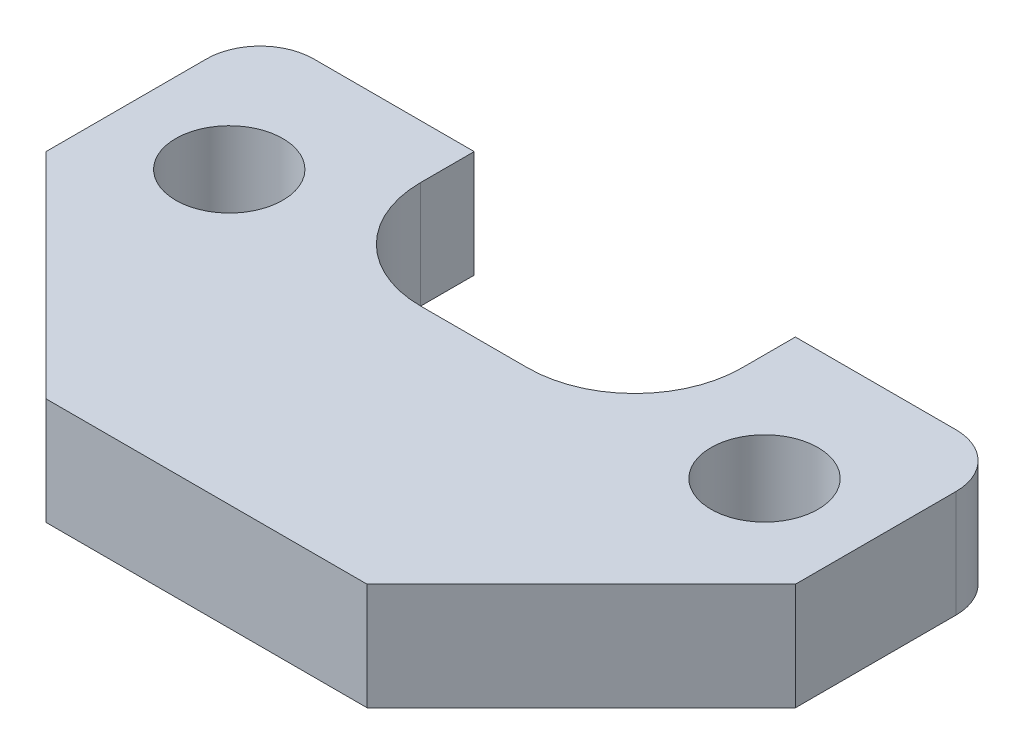
ISO-10303-21;
HEADER;
FILE_DESCRIPTION(('STEP AP214'),'2;1');
FILE_NAME('part.step','',(''),(''),'','','');
FILE_SCHEMA(('AUTOMOTIVE_DESIGN { 1 0 10303 214 1 1 1 1 }'));
ENDSEC;
DATA;
#1=APPLICATION_CONTEXT('core data for automotive mechanical design processes');
#2=APPLICATION_PROTOCOL_DEFINITION('international standard','automotive_design',2000,#1);
#3=PRODUCT_CONTEXT('',#1,'mechanical');
#4=PRODUCT('Part','Part','',(#3));
#5=PRODUCT_RELATED_PRODUCT_CATEGORY('part','',(#4));
#6=PRODUCT_DEFINITION_FORMATION('','',#4);
#7=PRODUCT_DEFINITION_CONTEXT('part definition',#1,'design');
#8=PRODUCT_DEFINITION('design','',#6,#7);
#9=PRODUCT_DEFINITION_SHAPE('','',#8);
#10=(LENGTH_UNIT() NAMED_UNIT(*) SI_UNIT(.MILLI.,.METRE.));
#11=(NAMED_UNIT(*) PLANE_ANGLE_UNIT() SI_UNIT($,.RADIAN.));
#12=(NAMED_UNIT(*) SI_UNIT($,.STERADIAN.) SOLID_ANGLE_UNIT());
#13=UNCERTAINTY_MEASURE_WITH_UNIT(LENGTH_MEASURE(1.E-05),#10,'distance_accuracy_value','');
#14=(GEOMETRIC_REPRESENTATION_CONTEXT(3) GLOBAL_UNCERTAINTY_ASSIGNED_CONTEXT((#13)) GLOBAL_UNIT_ASSIGNED_CONTEXT((#10,
#11,#12)) REPRESENTATION_CONTEXT('',''));
#15=CARTESIAN_POINT('',(0.,0.,0.));
#16=DIRECTION('',(0.,0.,1.));
#17=DIRECTION('',(1.,0.,0.));
#18=AXIS2_PLACEMENT_3D('',#15,#16,#17);
#19=CARTESIAN_POINT('',(-15.,-5.,-12.8823080147469));
#20=DIRECTION('',(1.,0.,0.));
#21=DIRECTION('',(0.,0.,-1.));
#22=AXIS2_PLACEMENT_3D('',#19,#20,#21);
#23=PLANE('',#22);
#24=DIRECTION('',(0.,1.,0.));
#25=VECTOR('',#24,1.);
#26=CARTESIAN_POINT('',(-15.,-5.,-12.8823080147469));
#27=LINE('',#26,#25);
#28=CARTESIAN_POINT('',(-15.,-5.,-12.8823080147469));
#29=VERTEX_POINT('',#28);
#30=CARTESIAN_POINT('',(-15.,5.,-12.8823080147469));
#31=VERTEX_POINT('',#30);
#32=EDGE_CURVE('E42',#29,#31,#27,.T.);
#33=ORIENTED_EDGE('',*,*,#32,.T.);
#34=DIRECTION('',(0.,0.,-1.));
#35=VECTOR('',#34,1.);
#36=CARTESIAN_POINT('',(-15.,5.,-12.8823080147469));
#37=LINE('',#36,#35);
#38=CARTESIAN_POINT('',(-15.,5.,-7.88230801474701));
#39=VERTEX_POINT('',#38);
#40=EDGE_CURVE('E139',#39,#31,#37,.T.);
#41=ORIENTED_EDGE('',*,*,#40,.F.);
#42=DIRECTION('',(0.,1.,0.));
#43=VECTOR('',#42,1.);
#44=CARTESIAN_POINT('',(-15.,-5.,-7.88230801474701));
#45=LINE('',#44,#43);
#46=CARTESIAN_POINT('',(-15.,-5.,-7.88230801474701));
#47=VERTEX_POINT('',#46);
#48=EDGE_CURVE('E11',#47,#39,#45,.T.);
#49=ORIENTED_EDGE('',*,*,#48,.F.);
#50=DIRECTION('',(0.,0.,-1.));
#51=VECTOR('',#50,1.);
#52=CARTESIAN_POINT('',(-15.,-5.,-12.8823080147469));
#53=LINE('',#52,#51);
#54=EDGE_CURVE('E140',#47,#29,#53,.T.);
#55=ORIENTED_EDGE('',*,*,#54,.T.);
#56=EDGE_LOOP('',(#33,#41,#49,#55));
#57=FACE_BOUND('',#56,.T.);
#58=ADVANCED_FACE('F39',(#57),#23,.T.);
#59=CARTESIAN_POINT('',(-4.99999999999999,-5.,-7.88230801474694));
#60=DIRECTION('',(0.,1.,0.));
#61=DIRECTION('',(0.,0.,1.));
#62=AXIS2_PLACEMENT_3D('',#59,#60,#61);
#63=CYLINDRICAL_SURFACE('',#62,10.);
#64=ORIENTED_EDGE('',*,*,#48,.T.);
#65=CARTESIAN_POINT('',(-4.99999999999999,5.,-7.88230801474694));
#66=DIRECTION('',(0.,-1.,0.));
#67=DIRECTION('',(0.,0.,1.));
#68=AXIS2_PLACEMENT_3D('',#65,#66,#67);
#69=CIRCLE('',#68,10.);
#70=CARTESIAN_POINT('',(-4.99999999999992,5.,2.11769198525306));
#71=VERTEX_POINT('',#70);
#72=EDGE_CURVE('E158',#71,#39,#69,.T.);
#73=ORIENTED_EDGE('',*,*,#72,.F.);
#74=DIRECTION('',(0.,1.,0.));
#75=VECTOR('',#74,1.);
#76=CARTESIAN_POINT('',(-4.99999999999992,-5.,2.11769198525306));
#77=LINE('',#76,#75);
#78=CARTESIAN_POINT('',(-4.99999999999992,-5.,2.11769198525306));
#79=VERTEX_POINT('',#78);
#80=EDGE_CURVE('E47',#79,#71,#77,.T.);
#81=ORIENTED_EDGE('',*,*,#80,.F.);
#82=CARTESIAN_POINT('',(-4.99999999999999,-5.,-7.88230801474694));
#83=DIRECTION('',(0.,-1.,0.));
#84=DIRECTION('',(0.,0.,1.));
#85=AXIS2_PLACEMENT_3D('',#82,#83,#84);
#86=CIRCLE('',#85,10.);
#87=EDGE_CURVE('E145',#79,#47,#86,.T.);
#88=ORIENTED_EDGE('',*,*,#87,.T.);
#89=EDGE_LOOP('',(#64,#73,#81,#88));
#90=FACE_BOUND('',#89,.T.);
#91=ADVANCED_FACE('F305',(#90),#63,.F.);
#92=CARTESIAN_POINT('',(-4.99999999999992,-5.,2.11769198525306));
#93=DIRECTION('',(0.,0.,-1.));
#94=DIRECTION('',(-1.,0.,0.));
#95=AXIS2_PLACEMENT_3D('',#92,#93,#94);
#96=PLANE('',#95);
#97=ORIENTED_EDGE('',*,*,#80,.T.);
#98=DIRECTION('',(-1.,0.,0.));
#99=VECTOR('',#98,1.);
#100=CARTESIAN_POINT('',(-4.99999999999992,5.,2.11769198525306));
#101=LINE('',#100,#99);
#102=CARTESIAN_POINT('',(4.99999999999993,5.,2.11769198525306));
#103=VERTEX_POINT('',#102);
#104=EDGE_CURVE('E194',#103,#71,#101,.T.);
#105=ORIENTED_EDGE('',*,*,#104,.F.);
#106=DIRECTION('',(0.,1.,0.));
#107=VECTOR('',#106,1.);
#108=CARTESIAN_POINT('',(4.99999999999993,-5.,2.11769198525306));
#109=LINE('',#108,#107);
#110=CARTESIAN_POINT('',(4.99999999999993,-5.,2.11769198525306));
#111=VERTEX_POINT('',#110);
#112=EDGE_CURVE('E240',#111,#103,#109,.T.);
#113=ORIENTED_EDGE('',*,*,#112,.F.);
#114=DIRECTION('',(-1.,0.,0.));
#115=VECTOR('',#114,1.);
#116=CARTESIAN_POINT('',(-4.99999999999992,-5.,2.11769198525306));
#117=LINE('',#116,#115);
#118=EDGE_CURVE('E236',#111,#79,#117,.T.);
#119=ORIENTED_EDGE('',*,*,#118,.T.);
#120=EDGE_LOOP('',(#97,#105,#113,#119));
#121=FACE_BOUND('',#120,.T.);
#122=ADVANCED_FACE('F304',(#121),#96,.T.);
#123=CARTESIAN_POINT('',(5.00000000000001,-5.,-7.88230801474694));
#124=DIRECTION('',(0.,1.,0.));
#125=DIRECTION('',(0.,0.,1.));
#126=AXIS2_PLACEMENT_3D('',#123,#124,#125);
#127=CYLINDRICAL_SURFACE('',#126,10.);
#128=ORIENTED_EDGE('',*,*,#112,.T.);
#129=CARTESIAN_POINT('',(5.00000000000001,5.,-7.88230801474694));
#130=DIRECTION('',(0.,-1.,0.));
#131=DIRECTION('',(0.,0.,-1.));
#132=AXIS2_PLACEMENT_3D('',#129,#130,#131);
#133=CIRCLE('',#132,10.);
#134=CARTESIAN_POINT('',(15.,5.,-7.88230801474701));
#135=VERTEX_POINT('',#134);
#136=EDGE_CURVE('E191',#135,#103,#133,.T.);
#137=ORIENTED_EDGE('',*,*,#136,.F.);
#138=DIRECTION('',(0.,1.,0.));
#139=VECTOR('',#138,1.);
#140=CARTESIAN_POINT('',(15.,-5.,-7.88230801474701));
#141=LINE('',#140,#139);
#142=CARTESIAN_POINT('',(15.,-5.,-7.88230801474701));
#143=VERTEX_POINT('',#142);
#144=EDGE_CURVE('E242',#143,#135,#141,.T.);
#145=ORIENTED_EDGE('',*,*,#144,.F.);
#146=CARTESIAN_POINT('',(5.00000000000001,-5.,-7.88230801474694));
#147=DIRECTION('',(0.,-1.,0.));
#148=DIRECTION('',(0.,0.,-1.));
#149=AXIS2_PLACEMENT_3D('',#146,#147,#148);
#150=CIRCLE('',#149,10.);
#151=EDGE_CURVE('E233',#143,#111,#150,.T.);
#152=ORIENTED_EDGE('',*,*,#151,.T.);
#153=EDGE_LOOP('',(#128,#137,#145,#152));
#154=FACE_BOUND('',#153,.T.);
#155=ADVANCED_FACE('F300',(#154),#127,.F.);
#156=CARTESIAN_POINT('',(15.,-5.,-12.8823080147469));
#157=DIRECTION('',(-1.,0.,0.));
#158=DIRECTION('',(0.,0.,1.));
#159=AXIS2_PLACEMENT_3D('',#156,#157,#158);
#160=PLANE('',#159);
#161=ORIENTED_EDGE('',*,*,#144,.T.);
#162=DIRECTION('',(0.,0.,1.));
#163=VECTOR('',#162,1.);
#164=CARTESIAN_POINT('',(15.,5.,-12.8823080147469));
#165=LINE('',#164,#163);
#166=CARTESIAN_POINT('',(15.,5.,-12.8823080147469));
#167=VERTEX_POINT('',#166);
#168=EDGE_CURVE('E188',#167,#135,#165,.T.);
#169=ORIENTED_EDGE('',*,*,#168,.F.);
#170=DIRECTION('',(0.,1.,0.));
#171=VECTOR('',#170,1.);
#172=CARTESIAN_POINT('',(15.,-5.,-12.8823080147469));
#173=LINE('',#172,#171);
#174=CARTESIAN_POINT('',(15.,-5.,-12.8823080147469));
#175=VERTEX_POINT('',#174);
#176=EDGE_CURVE('E244',#175,#167,#173,.T.);
#177=ORIENTED_EDGE('',*,*,#176,.F.);
#178=DIRECTION('',(0.,0.,1.));
#179=VECTOR('',#178,1.);
#180=CARTESIAN_POINT('',(15.,-5.,-12.8823080147469));
#181=LINE('',#180,#179);
#182=EDGE_CURVE('E230',#175,#143,#181,.T.);
#183=ORIENTED_EDGE('',*,*,#182,.T.);
#184=EDGE_LOOP('',(#161,#169,#177,#183));
#185=FACE_BOUND('',#184,.T.);
#186=ADVANCED_FACE('F295',(#185),#160,.T.);
#187=CARTESIAN_POINT('',(30.,-5.,-12.8823080147469));
#188=DIRECTION('',(0.,0.,-1.));
#189=DIRECTION('',(-1.,0.,0.));
#190=AXIS2_PLACEMENT_3D('',#187,#188,#189);
#191=PLANE('',#190);
#192=ORIENTED_EDGE('',*,*,#176,.T.);
#193=DIRECTION('',(-1.,0.,0.));
#194=VECTOR('',#193,1.);
#195=CARTESIAN_POINT('',(30.,5.,-12.8823080147469));
#196=LINE('',#195,#194);
#197=CARTESIAN_POINT('',(30.,5.,-12.8823080147469));
#198=VERTEX_POINT('',#197);
#199=EDGE_CURVE('E185',#198,#167,#196,.T.);
#200=ORIENTED_EDGE('',*,*,#199,.F.);
#201=DIRECTION('',(0.,1.,0.));
#202=VECTOR('',#201,1.);
#203=CARTESIAN_POINT('',(30.,-5.,-12.8823080147469));
#204=LINE('',#203,#202);
#205=CARTESIAN_POINT('',(30.,-5.,-12.8823080147469));
#206=VERTEX_POINT('',#205);
#207=EDGE_CURVE('E246',#206,#198,#204,.T.);
#208=ORIENTED_EDGE('',*,*,#207,.F.);
#209=DIRECTION('',(-1.,0.,0.));
#210=VECTOR('',#209,1.);
#211=CARTESIAN_POINT('',(30.,-5.,-12.8823080147469));
#212=LINE('',#211,#210);
#213=EDGE_CURVE('E227',#206,#175,#212,.T.);
#214=ORIENTED_EDGE('',*,*,#213,.T.);
#215=EDGE_LOOP('',(#192,#200,#208,#214));
#216=FACE_BOUND('',#215,.T.);
#217=ADVANCED_FACE('F293',(#216),#191,.T.);
#218=CARTESIAN_POINT('',(30.,-5.,-7.88230801474694));
#219=DIRECTION('',(0.,1.,0.));
#220=DIRECTION('',(0.,0.,1.));
#221=AXIS2_PLACEMENT_3D('',#218,#219,#220);
#222=CYLINDRICAL_SURFACE('',#221,5.);
#223=ORIENTED_EDGE('',*,*,#207,.T.);
#224=CARTESIAN_POINT('',(30.,5.,-7.88230801474694));
#225=DIRECTION('',(0.,1.,0.));
#226=DIRECTION('',(0.,0.,1.));
#227=AXIS2_PLACEMENT_3D('',#224,#225,#226);
#228=CIRCLE('',#227,5.);
#229=CARTESIAN_POINT('',(35.,5.,-7.8823080147469));
#230=VERTEX_POINT('',#229);
#231=EDGE_CURVE('E182',#230,#198,#228,.T.);
#232=ORIENTED_EDGE('',*,*,#231,.F.);
#233=DIRECTION('',(0.,1.,0.));
#234=VECTOR('',#233,1.);
#235=CARTESIAN_POINT('',(35.,-5.,-7.8823080147469));
#236=LINE('',#235,#234);
#237=CARTESIAN_POINT('',(35.,-5.,-7.8823080147469));
#238=VERTEX_POINT('',#237);
#239=EDGE_CURVE('E248',#238,#230,#236,.T.);
#240=ORIENTED_EDGE('',*,*,#239,.F.);
#241=CARTESIAN_POINT('',(30.,-5.,-7.88230801474694));
#242=DIRECTION('',(0.,1.,0.));
#243=DIRECTION('',(0.,0.,1.));
#244=AXIS2_PLACEMENT_3D('',#241,#242,#243);
#245=CIRCLE('',#244,5.);
#246=EDGE_CURVE('E224',#238,#206,#245,.T.);
#247=ORIENTED_EDGE('',*,*,#246,.T.);
#248=EDGE_LOOP('',(#223,#232,#240,#247));
#249=FACE_BOUND('',#248,.T.);
#250=ADVANCED_FACE('F288',(#249),#222,.T.);
#251=CARTESIAN_POINT('',(35.,-5.,7.11769198525307));
#252=DIRECTION('',(1.,0.,0.));
#253=DIRECTION('',(0.,0.,-1.));
#254=AXIS2_PLACEMENT_3D('',#251,#252,#253);
#255=PLANE('',#254);
#256=ORIENTED_EDGE('',*,*,#239,.T.);
#257=DIRECTION('',(0.,0.,-1.));
#258=VECTOR('',#257,1.);
#259=CARTESIAN_POINT('',(35.,5.,7.11769198525307));
#260=LINE('',#259,#258);
#261=CARTESIAN_POINT('',(35.,5.,7.11769198525307));
#262=VERTEX_POINT('',#261);
#263=EDGE_CURVE('E179',#262,#230,#260,.T.);
#264=ORIENTED_EDGE('',*,*,#263,.F.);
#265=DIRECTION('',(0.,1.,0.));
#266=VECTOR('',#265,1.);
#267=CARTESIAN_POINT('',(35.,-5.,7.11769198525307));
#268=LINE('',#267,#266);
#269=CARTESIAN_POINT('',(35.,-5.,7.11769198525307));
#270=VERTEX_POINT('',#269);
#271=EDGE_CURVE('E250',#270,#262,#268,.T.);
#272=ORIENTED_EDGE('',*,*,#271,.F.);
#273=DIRECTION('',(0.,0.,-1.));
#274=VECTOR('',#273,1.);
#275=CARTESIAN_POINT('',(35.,-5.,7.11769198525307));
#276=LINE('',#275,#274);
#277=EDGE_CURVE('E221',#270,#238,#276,.T.);
#278=ORIENTED_EDGE('',*,*,#277,.T.);
#279=EDGE_LOOP('',(#256,#264,#272,#278));
#280=FACE_BOUND('',#279,.T.);
#281=ADVANCED_FACE('F283',(#280),#255,.T.);
#282=CARTESIAN_POINT('',(15.,-5.,27.1176919852531));
#283=DIRECTION('',(0.707106781186547,0.,0.707106781186548));
#284=DIRECTION('',(0.707106781186548,0.,-0.707106781186547));
#285=AXIS2_PLACEMENT_3D('',#282,#283,#284);
#286=PLANE('',#285);
#287=ORIENTED_EDGE('',*,*,#271,.T.);
#288=DIRECTION('',(0.707106781186548,0.,-0.707106781186547));
#289=VECTOR('',#288,1.);
#290=CARTESIAN_POINT('',(15.,5.,27.1176919852531));
#291=LINE('',#290,#289);
#292=CARTESIAN_POINT('',(15.,5.,27.1176919852531));
#293=VERTEX_POINT('',#292);
#294=EDGE_CURVE('E176',#293,#262,#291,.T.);
#295=ORIENTED_EDGE('',*,*,#294,.F.);
#296=DIRECTION('',(0.,1.,0.));
#297=VECTOR('',#296,1.);
#298=CARTESIAN_POINT('',(15.,-5.,27.1176919852531));
#299=LINE('',#298,#297);
#300=CARTESIAN_POINT('',(15.,-5.,27.1176919852531));
#301=VERTEX_POINT('',#300);
#302=EDGE_CURVE('E252',#301,#293,#299,.T.);
#303=ORIENTED_EDGE('',*,*,#302,.F.);
#304=DIRECTION('',(0.707106781186548,0.,-0.707106781186547));
#305=VECTOR('',#304,1.);
#306=CARTESIAN_POINT('',(15.,-5.,27.1176919852531));
#307=LINE('',#306,#305);
#308=EDGE_CURVE('E218',#301,#270,#307,.T.);
#309=ORIENTED_EDGE('',*,*,#308,.T.);
#310=EDGE_LOOP('',(#287,#295,#303,#309));
#311=FACE_BOUND('',#310,.T.);
#312=ADVANCED_FACE('F281',(#311),#286,.T.);
#313=CARTESIAN_POINT('',(-15.,-5.,27.1176919852531));
#314=DIRECTION('',(0.,0.,1.));
#315=DIRECTION('',(1.,0.,0.));
#316=AXIS2_PLACEMENT_3D('',#313,#314,#315);
#317=PLANE('',#316);
#318=ORIENTED_EDGE('',*,*,#302,.T.);
#319=DIRECTION('',(1.,0.,0.));
#320=VECTOR('',#319,1.);
#321=CARTESIAN_POINT('',(-15.,5.,27.1176919852531));
#322=LINE('',#321,#320);
#323=CARTESIAN_POINT('',(-15.,5.,27.1176919852531));
#324=VERTEX_POINT('',#323);
#325=EDGE_CURVE('E173',#324,#293,#322,.T.);
#326=ORIENTED_EDGE('',*,*,#325,.F.);
#327=DIRECTION('',(0.,1.,0.));
#328=VECTOR('',#327,1.);
#329=CARTESIAN_POINT('',(-15.,-5.,27.1176919852531));
#330=LINE('',#329,#328);
#331=CARTESIAN_POINT('',(-15.,-5.,27.1176919852531));
#332=VERTEX_POINT('',#331);
#333=EDGE_CURVE('E254',#332,#324,#330,.T.);
#334=ORIENTED_EDGE('',*,*,#333,.F.);
#335=DIRECTION('',(1.,0.,0.));
#336=VECTOR('',#335,1.);
#337=CARTESIAN_POINT('',(-15.,-5.,27.1176919852531));
#338=LINE('',#337,#336);
#339=EDGE_CURVE('E215',#332,#301,#338,.T.);
#340=ORIENTED_EDGE('',*,*,#339,.T.);
#341=EDGE_LOOP('',(#318,#326,#334,#340));
#342=FACE_BOUND('',#341,.T.);
#343=ADVANCED_FACE('F276',(#342),#317,.T.);
#344=CARTESIAN_POINT('',(-15.,-5.,27.1176919852531));
#345=DIRECTION('',(-0.707106781186547,0.,0.707106781186548));
#346=DIRECTION('',(0.707106781186548,0.,0.707106781186547));
#347=AXIS2_PLACEMENT_3D('',#344,#345,#346);
#348=PLANE('',#347);
#349=ORIENTED_EDGE('',*,*,#333,.T.);
#350=DIRECTION('',(0.707106781186548,0.,0.707106781186547));
#351=VECTOR('',#350,1.);
#352=CARTESIAN_POINT('',(-15.,5.,27.1176919852531));
#353=LINE('',#352,#351);
#354=CARTESIAN_POINT('',(-35.,5.,7.11769198525307));
#355=VERTEX_POINT('',#354);
#356=EDGE_CURVE('E170',#355,#324,#353,.T.);
#357=ORIENTED_EDGE('',*,*,#356,.F.);
#358=DIRECTION('',(0.,1.,0.));
#359=VECTOR('',#358,1.);
#360=CARTESIAN_POINT('',(-35.,-5.,7.11769198525307));
#361=LINE('',#360,#359);
#362=CARTESIAN_POINT('',(-35.,-5.,7.11769198525307));
#363=VERTEX_POINT('',#362);
#364=EDGE_CURVE('E256',#363,#355,#361,.T.);
#365=ORIENTED_EDGE('',*,*,#364,.F.);
#366=DIRECTION('',(0.707106781186548,0.,0.707106781186547));
#367=VECTOR('',#366,1.);
#368=CARTESIAN_POINT('',(-15.,-5.,27.1176919852531));
#369=LINE('',#368,#367);
#370=EDGE_CURVE('E212',#363,#332,#369,.T.);
#371=ORIENTED_EDGE('',*,*,#370,.T.);
#372=EDGE_LOOP('',(#349,#357,#365,#371));
#373=FACE_BOUND('',#372,.T.);
#374=ADVANCED_FACE('F269',(#373),#348,.T.);
#375=CARTESIAN_POINT('',(-35.,-5.,7.11769198525307));
#376=DIRECTION('',(-1.,0.,0.));
#377=DIRECTION('',(0.,0.,1.));
#378=AXIS2_PLACEMENT_3D('',#375,#376,#377);
#379=PLANE('',#378);
#380=ORIENTED_EDGE('',*,*,#364,.T.);
#381=DIRECTION('',(0.,0.,1.));
#382=VECTOR('',#381,1.);
#383=CARTESIAN_POINT('',(-35.,5.,7.11769198525307));
#384=LINE('',#383,#382);
#385=CARTESIAN_POINT('',(-35.,5.,-7.8823080147469));
#386=VERTEX_POINT('',#385);
#387=EDGE_CURVE('E167',#386,#355,#384,.T.);
#388=ORIENTED_EDGE('',*,*,#387,.F.);
#389=DIRECTION('',(0.,1.,0.));
#390=VECTOR('',#389,1.);
#391=CARTESIAN_POINT('',(-35.,-5.,-7.8823080147469));
#392=LINE('',#391,#390);
#393=CARTESIAN_POINT('',(-35.,-5.,-7.8823080147469));
#394=VERTEX_POINT('',#393);
#395=EDGE_CURVE('E258',#394,#386,#392,.T.);
#396=ORIENTED_EDGE('',*,*,#395,.F.);
#397=DIRECTION('',(0.,0.,1.));
#398=VECTOR('',#397,1.);
#399=CARTESIAN_POINT('',(-35.,-5.,7.11769198525307));
#400=LINE('',#399,#398);
#401=EDGE_CURVE('E209',#394,#363,#400,.T.);
#402=ORIENTED_EDGE('',*,*,#401,.T.);
#403=EDGE_LOOP('',(#380,#388,#396,#402));
#404=FACE_BOUND('',#403,.T.);
#405=ADVANCED_FACE('F266',(#404),#379,.T.);
#406=CARTESIAN_POINT('',(-30.,-5.,-7.88230801474694));
#407=DIRECTION('',(0.,1.,0.));
#408=DIRECTION('',(0.,0.,1.));
#409=AXIS2_PLACEMENT_3D('',#406,#407,#408);
#410=CYLINDRICAL_SURFACE('',#409,5.);
#411=ORIENTED_EDGE('',*,*,#395,.T.);
#412=CARTESIAN_POINT('',(-30.,5.,-7.88230801474694));
#413=DIRECTION('',(0.,1.,0.));
#414=DIRECTION('',(0.,0.,1.));
#415=AXIS2_PLACEMENT_3D('',#412,#413,#414);
#416=CIRCLE('',#415,5.);
#417=CARTESIAN_POINT('',(-30.,5.,-12.8823080147469));
#418=VERTEX_POINT('',#417);
#419=EDGE_CURVE('E152',#418,#386,#416,.T.);
#420=ORIENTED_EDGE('',*,*,#419,.F.);
#421=DIRECTION('',(0.,1.,0.));
#422=VECTOR('',#421,1.);
#423=CARTESIAN_POINT('',(-30.,-5.,-12.8823080147469));
#424=LINE('',#423,#422);
#425=CARTESIAN_POINT('',(-30.,-5.,-12.8823080147469));
#426=VERTEX_POINT('',#425);
#427=EDGE_CURVE('E144',#426,#418,#424,.T.);
#428=ORIENTED_EDGE('',*,*,#427,.F.);
#429=CARTESIAN_POINT('',(-30.,-5.,-7.88230801474694));
#430=DIRECTION('',(0.,1.,0.));
#431=DIRECTION('',(0.,0.,1.));
#432=AXIS2_PLACEMENT_3D('',#429,#430,#431);
#433=CIRCLE('',#432,5.);
#434=EDGE_CURVE('E206',#426,#394,#433,.T.);
#435=ORIENTED_EDGE('',*,*,#434,.T.);
#436=EDGE_LOOP('',(#411,#420,#428,#435));
#437=FACE_BOUND('',#436,.T.);
#438=ADVANCED_FACE('F260',(#437),#410,.T.);
#439=CARTESIAN_POINT('',(-30.,-5.,-12.8823080147469));
#440=DIRECTION('',(0.,0.,-1.));
#441=DIRECTION('',(-1.,0.,0.));
#442=AXIS2_PLACEMENT_3D('',#439,#440,#441);
#443=PLANE('',#442);
#444=ORIENTED_EDGE('',*,*,#427,.T.);
#445=DIRECTION('',(-1.,0.,0.));
#446=VECTOR('',#445,1.);
#447=CARTESIAN_POINT('',(-30.,5.,-12.8823080147469));
#448=LINE('',#447,#446);
#449=EDGE_CURVE('E147',#31,#418,#448,.T.);
#450=ORIENTED_EDGE('',*,*,#449,.F.);
#451=ORIENTED_EDGE('',*,*,#32,.F.);
#452=DIRECTION('',(-1.,0.,0.));
#453=VECTOR('',#452,1.);
#454=CARTESIAN_POINT('',(-30.,-5.,-12.8823080147469));
#455=LINE('',#454,#453);
#456=EDGE_CURVE('E204',#29,#426,#455,.T.);
#457=ORIENTED_EDGE('',*,*,#456,.T.);
#458=EDGE_LOOP('',(#444,#450,#451,#457));
#459=FACE_BOUND('',#458,.T.);
#460=ADVANCED_FACE('F148',(#459),#443,.T.);
#461=CARTESIAN_POINT('',(-4.99999999999999,-5.,-7.88230801474694));
#462=DIRECTION('',(0.,1.,0.));
#463=DIRECTION('',(0.,0.,1.));
#464=AXIS2_PLACEMENT_3D('',#461,#462,#463);
#465=PLANE('',#464);
#466=CARTESIAN_POINT('',(25.,-5.,0.));
#467=DIRECTION('',(0.,1.,0.));
#468=DIRECTION('',(0.,0.,-1.));
#469=AXIS2_PLACEMENT_3D('',#466,#467,#468);
#470=CIRCLE('',#469,5.);
#471=CARTESIAN_POINT('',(25.,-5.,-5.));
#472=VERTEX_POINT('',#471);
#473=EDGE_CURVE('E197',#472,#472,#470,.T.);
#474=ORIENTED_EDGE('',*,*,#473,.T.);
#475=EDGE_LOOP('',(#474));
#476=FACE_BOUND('',#475,.T.);
#477=CARTESIAN_POINT('',(-25.,-5.,0.));
#478=DIRECTION('',(0.,1.,0.));
#479=DIRECTION('',(0.,0.,1.));
#480=AXIS2_PLACEMENT_3D('',#477,#478,#479);
#481=CIRCLE('',#480,5.);
#482=CARTESIAN_POINT('',(-25.,-5.,5.));
#483=VERTEX_POINT('',#482);
#484=EDGE_CURVE('E200',#483,#483,#481,.T.);
#485=ORIENTED_EDGE('',*,*,#484,.T.);
#486=EDGE_LOOP('',(#485));
#487=FACE_BOUND('',#486,.T.);
#488=ORIENTED_EDGE('',*,*,#54,.F.);
#489=ORIENTED_EDGE('',*,*,#87,.F.);
#490=ORIENTED_EDGE('',*,*,#118,.F.);
#491=ORIENTED_EDGE('',*,*,#151,.F.);
#492=ORIENTED_EDGE('',*,*,#182,.F.);
#493=ORIENTED_EDGE('',*,*,#213,.F.);
#494=ORIENTED_EDGE('',*,*,#246,.F.);
#495=ORIENTED_EDGE('',*,*,#277,.F.);
#496=ORIENTED_EDGE('',*,*,#308,.F.);
#497=ORIENTED_EDGE('',*,*,#339,.F.);
#498=ORIENTED_EDGE('',*,*,#370,.F.);
#499=ORIENTED_EDGE('',*,*,#401,.F.);
#500=ORIENTED_EDGE('',*,*,#434,.F.);
#501=ORIENTED_EDGE('',*,*,#456,.F.);
#502=EDGE_LOOP('',(#488,#489,#490,#491,#492,#493,#494,#495,#496,#497,#498,#499,#500,#501));
#503=FACE_BOUND('',#502,.T.);
#504=ADVANCED_FACE('F272',(#476,#487,#503),#465,.F.);
#505=CARTESIAN_POINT('',(-25.,-5.,0.));
#506=DIRECTION('',(0.,1.,0.));
#507=DIRECTION('',(0.,0.,1.));
#508=AXIS2_PLACEMENT_3D('',#505,#506,#507);
#509=CYLINDRICAL_SURFACE('',#508,5.);
#510=ORIENTED_EDGE('',*,*,#484,.F.);
#511=EDGE_LOOP('',(#510));
#512=FACE_BOUND('',#511,.T.);
#513=CARTESIAN_POINT('',(-25.,5.,0.));
#514=DIRECTION('',(0.,1.,0.));
#515=DIRECTION('',(0.,0.,1.));
#516=AXIS2_PLACEMENT_3D('',#513,#514,#515);
#517=CIRCLE('',#516,5.);
#518=CARTESIAN_POINT('',(-25.,5.,5.));
#519=VERTEX_POINT('',#518);
#520=EDGE_CURVE('E159',#519,#519,#517,.T.);
#521=ORIENTED_EDGE('',*,*,#520,.T.);
#522=EDGE_LOOP('',(#521));
#523=FACE_BOUND('',#522,.T.);
#524=ADVANCED_FACE('F339',(#512,#523),#509,.F.);
#525=CARTESIAN_POINT('',(25.,-5.,0.));
#526=DIRECTION('',(0.,1.,0.));
#527=DIRECTION('',(0.,0.,1.));
#528=AXIS2_PLACEMENT_3D('',#525,#526,#527);
#529=CYLINDRICAL_SURFACE('',#528,5.);
#530=ORIENTED_EDGE('',*,*,#473,.F.);
#531=EDGE_LOOP('',(#530));
#532=FACE_BOUND('',#531,.T.);
#533=CARTESIAN_POINT('',(25.,5.,0.));
#534=DIRECTION('',(0.,1.,0.));
#535=DIRECTION('',(0.,0.,-1.));
#536=AXIS2_PLACEMENT_3D('',#533,#534,#535);
#537=CIRCLE('',#536,5.);
#538=CARTESIAN_POINT('',(25.,5.,-5.));
#539=VERTEX_POINT('',#538);
#540=EDGE_CURVE('E162',#539,#539,#537,.T.);
#541=ORIENTED_EDGE('',*,*,#540,.T.);
#542=EDGE_LOOP('',(#541));
#543=FACE_BOUND('',#542,.T.);
#544=ADVANCED_FACE('F344',(#532,#543),#529,.F.);
#545=CARTESIAN_POINT('',(-4.99999999999999,5.,-7.88230801474694));
#546=DIRECTION('',(0.,1.,0.));
#547=DIRECTION('',(0.,0.,1.));
#548=AXIS2_PLACEMENT_3D('',#545,#546,#547);
#549=PLANE('',#548);
#550=ORIENTED_EDGE('',*,*,#520,.F.);
#551=EDGE_LOOP('',(#550));
#552=FACE_BOUND('',#551,.T.);
#553=ORIENTED_EDGE('',*,*,#40,.T.);
#554=ORIENTED_EDGE('',*,*,#449,.T.);
#555=ORIENTED_EDGE('',*,*,#419,.T.);
#556=ORIENTED_EDGE('',*,*,#387,.T.);
#557=ORIENTED_EDGE('',*,*,#356,.T.);
#558=ORIENTED_EDGE('',*,*,#325,.T.);
#559=ORIENTED_EDGE('',*,*,#294,.T.);
#560=ORIENTED_EDGE('',*,*,#263,.T.);
#561=ORIENTED_EDGE('',*,*,#231,.T.);
#562=ORIENTED_EDGE('',*,*,#199,.T.);
#563=ORIENTED_EDGE('',*,*,#168,.T.);
#564=ORIENTED_EDGE('',*,*,#136,.T.);
#565=ORIENTED_EDGE('',*,*,#104,.T.);
#566=ORIENTED_EDGE('',*,*,#72,.T.);
#567=EDGE_LOOP('',(#553,#554,#555,#556,#557,#558,#559,#560,#561,#562,#563,#564,#565,#566));
#568=FACE_BOUND('',#567,.T.);
#569=ORIENTED_EDGE('',*,*,#540,.F.);
#570=EDGE_LOOP('',(#569));
#571=FACE_BOUND('',#570,.T.);
#572=ADVANCED_FACE('F155',(#552,#568,#571),#549,.T.);
#573=CLOSED_SHELL('',(#58,#91,#122,#155,#186,#217,#250,#281,#312,#343,#374,#405,#438,#460,#504,
#524,#544,#572));
#574=MANIFOLD_SOLID_BREP('B2',#573);
#575=ADVANCED_BREP_SHAPE_REPRESENTATION('',(#18,#574),#14);
#576=SHAPE_DEFINITION_REPRESENTATION(#9,#575);
ENDSEC;
END-ISO-10303-21;
